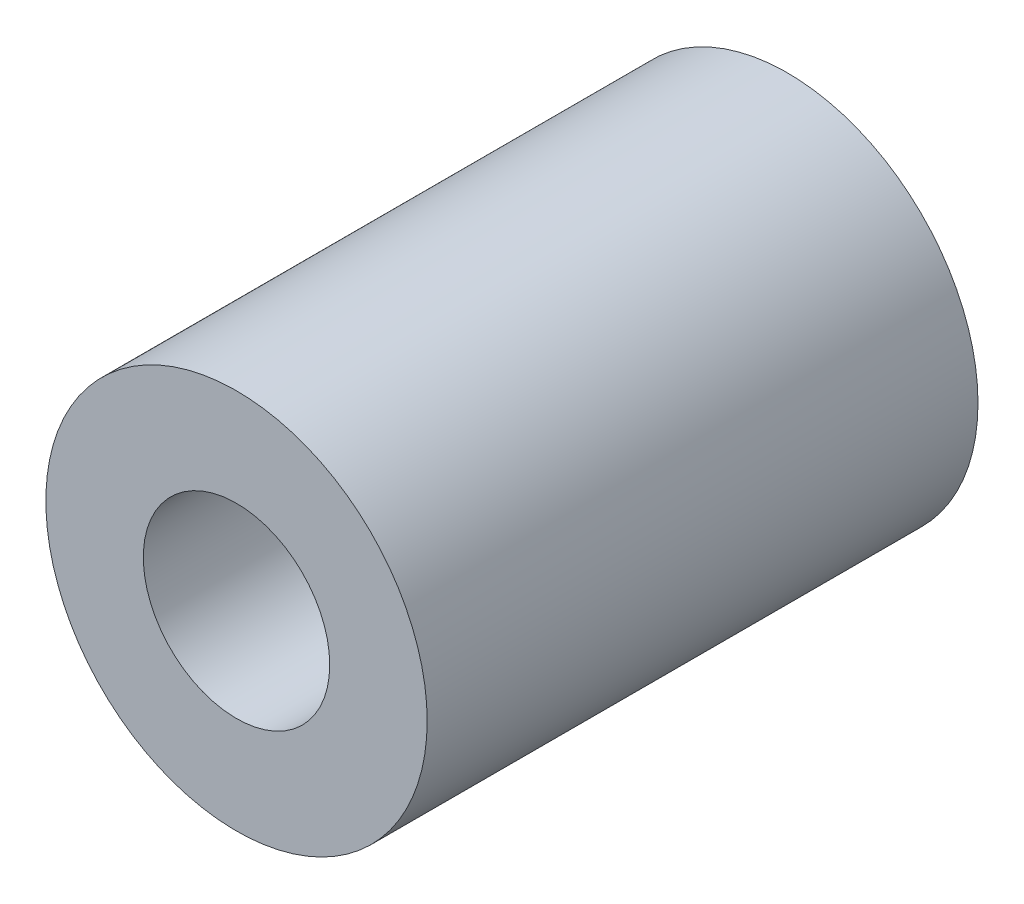
ISO-10303-21;
HEADER;
FILE_DESCRIPTION(('STEP AP214'),'2;1');
FILE_NAME('part.step','',(''),(''),'','','');
FILE_SCHEMA(('AUTOMOTIVE_DESIGN { 1 0 10303 214 1 1 1 1 }'));
ENDSEC;
DATA;
#1=APPLICATION_CONTEXT('core data for automotive mechanical design processes');
#2=APPLICATION_PROTOCOL_DEFINITION('international standard','automotive_design',2000,#1);
#3=PRODUCT_CONTEXT('',#1,'mechanical');
#4=PRODUCT('Part','Part','',(#3));
#5=PRODUCT_RELATED_PRODUCT_CATEGORY('part','',(#4));
#6=PRODUCT_DEFINITION_FORMATION('','',#4);
#7=PRODUCT_DEFINITION_CONTEXT('part definition',#1,'design');
#8=PRODUCT_DEFINITION('design','',#6,#7);
#9=PRODUCT_DEFINITION_SHAPE('','',#8);
#10=(LENGTH_UNIT() NAMED_UNIT(*) SI_UNIT(.MILLI.,.METRE.));
#11=(NAMED_UNIT(*) PLANE_ANGLE_UNIT() SI_UNIT($,.RADIAN.));
#12=(NAMED_UNIT(*) SI_UNIT($,.STERADIAN.) SOLID_ANGLE_UNIT());
#13=UNCERTAINTY_MEASURE_WITH_UNIT(LENGTH_MEASURE(1.E-05),#10,'distance_accuracy_value','');
#14=(GEOMETRIC_REPRESENTATION_CONTEXT(3) GLOBAL_UNCERTAINTY_ASSIGNED_CONTEXT((#13)) GLOBAL_UNIT_ASSIGNED_CONTEXT((#10,
#11,#12)) REPRESENTATION_CONTEXT('',''));
#15=CARTESIAN_POINT('',(0.,0.,0.));
#16=DIRECTION('',(0.,0.,1.));
#17=DIRECTION('',(1.,0.,0.));
#18=AXIS2_PLACEMENT_3D('',#15,#16,#17);
#19=CARTESIAN_POINT('',(0.,0.,13.));
#20=DIRECTION('',(0.,0.,1.));
#21=DIRECTION('',(1.,0.,0.));
#22=AXIS2_PLACEMENT_3D('',#19,#20,#21);
#23=PLANE('',#22);
#24=CARTESIAN_POINT('',(0.,0.,13.));
#25=DIRECTION('',(0.,0.,1.));
#26=DIRECTION('',(1.,0.,0.));
#27=AXIS2_PLACEMENT_3D('',#24,#25,#26);
#28=CIRCLE('',#27,4.5);
#29=CARTESIAN_POINT('',(4.5,0.,13.));
#30=VERTEX_POINT('',#29);
#31=EDGE_CURVE('E10',#30,#30,#28,.T.);
#32=ORIENTED_EDGE('',*,*,#31,.T.);
#33=EDGE_LOOP('',(#32));
#34=FACE_BOUND('',#33,.T.);
#35=CARTESIAN_POINT('',(0.,0.,13.));
#36=DIRECTION('',(0.,0.,1.));
#37=DIRECTION('',(1.,0.,0.));
#38=AXIS2_PLACEMENT_3D('',#35,#36,#37);
#39=CIRCLE('',#38,2.2);
#40=CARTESIAN_POINT('',(2.2,0.,13.));
#41=VERTEX_POINT('',#40);
#42=EDGE_CURVE('E48',#41,#41,#39,.T.);
#43=ORIENTED_EDGE('',*,*,#42,.F.);
#44=EDGE_LOOP('',(#43));
#45=FACE_BOUND('',#44,.T.);
#46=ADVANCED_FACE('F40',(#34,#45),#23,.T.);
#47=CARTESIAN_POINT('',(0.,0.,0.));
#48=DIRECTION('',(0.,0.,1.));
#49=DIRECTION('',(1.,0.,0.));
#50=AXIS2_PLACEMENT_3D('',#47,#48,#49);
#51=PLANE('',#50);
#52=CARTESIAN_POINT('',(0.,0.,0.));
#53=DIRECTION('',(0.,0.,1.));
#54=DIRECTION('',(1.,0.,0.));
#55=AXIS2_PLACEMENT_3D('',#52,#53,#54);
#56=CIRCLE('',#55,4.5);
#57=CARTESIAN_POINT('',(4.5,0.,0.));
#58=VERTEX_POINT('',#57);
#59=EDGE_CURVE('E41',#58,#58,#56,.T.);
#60=ORIENTED_EDGE('',*,*,#59,.F.);
#61=EDGE_LOOP('',(#60));
#62=FACE_BOUND('',#61,.T.);
#63=CARTESIAN_POINT('',(0.,0.,0.));
#64=DIRECTION('',(0.,0.,1.));
#65=DIRECTION('',(1.,0.,0.));
#66=AXIS2_PLACEMENT_3D('',#63,#64,#65);
#67=CIRCLE('',#66,2.2);
#68=CARTESIAN_POINT('',(2.2,0.,0.));
#69=VERTEX_POINT('',#68);
#70=EDGE_CURVE('E49',#69,#69,#67,.T.);
#71=ORIENTED_EDGE('',*,*,#70,.T.);
#72=EDGE_LOOP('',(#71));
#73=FACE_BOUND('',#72,.T.);
#74=ADVANCED_FACE('F58',(#62,#73),#51,.F.);
#75=CARTESIAN_POINT('',(0.,0.,13.));
#76=DIRECTION('',(0.,0.,-1.));
#77=DIRECTION('',(-1.,0.,0.));
#78=AXIS2_PLACEMENT_3D('',#75,#76,#77);
#79=CYLINDRICAL_SURFACE('',#78,4.5);
#80=ORIENTED_EDGE('',*,*,#31,.F.);
#81=EDGE_LOOP('',(#80));
#82=FACE_BOUND('',#81,.T.);
#83=ORIENTED_EDGE('',*,*,#59,.T.);
#84=EDGE_LOOP('',(#83));
#85=FACE_BOUND('',#84,.T.);
#86=ADVANCED_FACE('F39',(#82,#85),#79,.T.);
#87=CARTESIAN_POINT('',(0.,0.,13.));
#88=DIRECTION('',(0.,0.,-1.));
#89=DIRECTION('',(-1.,0.,0.));
#90=AXIS2_PLACEMENT_3D('',#87,#88,#89);
#91=CYLINDRICAL_SURFACE('',#90,2.2);
#92=ORIENTED_EDGE('',*,*,#42,.T.);
#93=EDGE_LOOP('',(#92));
#94=FACE_BOUND('',#93,.T.);
#95=ORIENTED_EDGE('',*,*,#70,.F.);
#96=EDGE_LOOP('',(#95));
#97=FACE_BOUND('',#96,.T.);
#98=ADVANCED_FACE('F57',(#94,#97),#91,.F.);
#99=CLOSED_SHELL('',(#46,#74,#86,#98));
#100=MANIFOLD_SOLID_BREP('B2',#99);
#101=ADVANCED_BREP_SHAPE_REPRESENTATION('',(#18,#100),#14);
#102=SHAPE_DEFINITION_REPRESENTATION(#9,#101);
ENDSEC;
END-ISO-10303-21;
